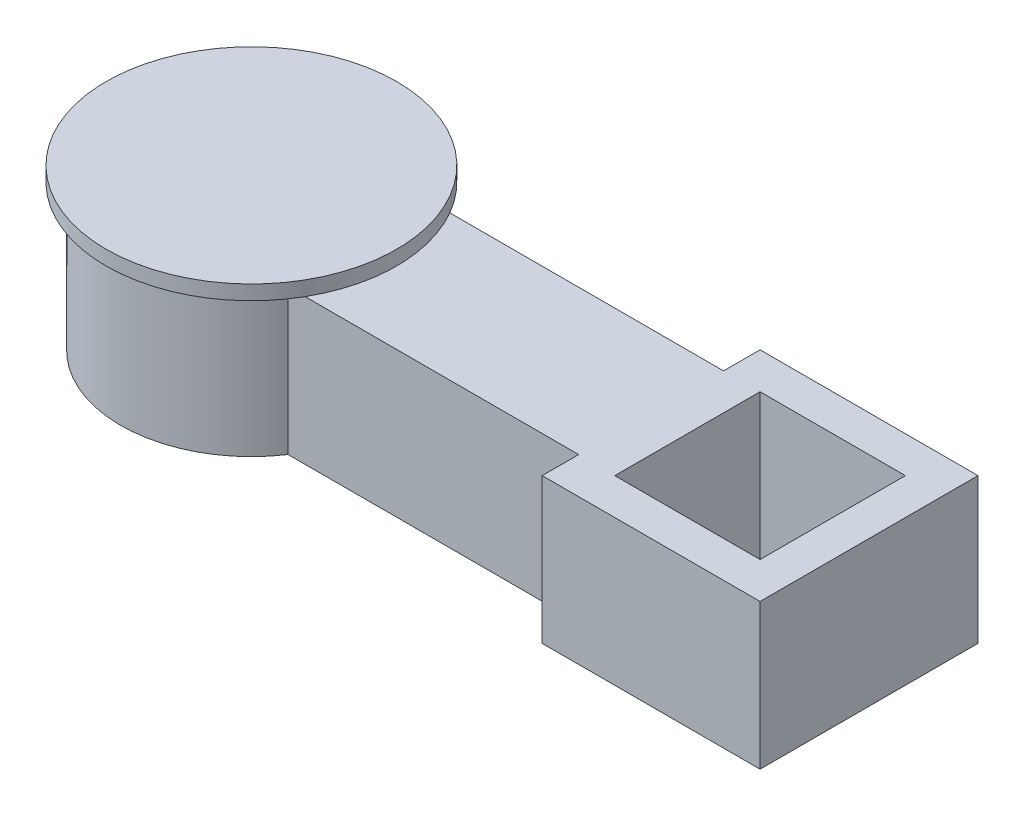
ISO-10303-21;
HEADER;
FILE_DESCRIPTION(('STEP AP214'),'2;1');
FILE_NAME('part.step','',(''),(''),'','','');
FILE_SCHEMA(('AUTOMOTIVE_DESIGN { 1 0 10303 214 1 1 1 1 }'));
ENDSEC;
DATA;
#1=APPLICATION_CONTEXT('core data for automotive mechanical design processes');
#2=APPLICATION_PROTOCOL_DEFINITION('international standard','automotive_design',2000,#1);
#3=PRODUCT_CONTEXT('',#1,'mechanical');
#4=PRODUCT('Part','Part','',(#3));
#5=PRODUCT_RELATED_PRODUCT_CATEGORY('part','',(#4));
#6=PRODUCT_DEFINITION_FORMATION('','',#4);
#7=PRODUCT_DEFINITION_CONTEXT('part definition',#1,'design');
#8=PRODUCT_DEFINITION('design','',#6,#7);
#9=PRODUCT_DEFINITION_SHAPE('','',#8);
#10=(LENGTH_UNIT() NAMED_UNIT(*) SI_UNIT(.MILLI.,.METRE.));
#11=(NAMED_UNIT(*) PLANE_ANGLE_UNIT() SI_UNIT($,.RADIAN.));
#12=(NAMED_UNIT(*) SI_UNIT($,.STERADIAN.) SOLID_ANGLE_UNIT());
#13=UNCERTAINTY_MEASURE_WITH_UNIT(LENGTH_MEASURE(1.E-05),#10,'distance_accuracy_value','');
#14=(GEOMETRIC_REPRESENTATION_CONTEXT(3) GLOBAL_UNCERTAINTY_ASSIGNED_CONTEXT((#13)) GLOBAL_UNIT_ASSIGNED_CONTEXT((#10,
#11,#12)) REPRESENTATION_CONTEXT('',''));
#15=CARTESIAN_POINT('',(0.,0.,0.));
#16=DIRECTION('',(0.,0.,1.));
#17=DIRECTION('',(1.,0.,0.));
#18=AXIS2_PLACEMENT_3D('',#15,#16,#17);
#19=CARTESIAN_POINT('',(363.145565833727,100.,8.04324209101972E-11));
#20=DIRECTION('',(-1.,0.,-2.21488098651395E-13));
#21=DIRECTION('',(-2.21488098651395E-13,0.,1.));
#22=AXIS2_PLACEMENT_3D('',#19,#20,#21);
#23=PLANE('',#22);
#24=DIRECTION('',(2.21488098651395E-13,0.,-1.));
#25=VECTOR('',#24,1.);
#26=CARTESIAN_POINT('',(363.145565833727,0.,8.04324209101972E-11));
#27=LINE('',#26,#25);
#28=CARTESIAN_POINT('',(363.145565833788,0.,-275.741810418657));
#29=VERTEX_POINT('',#28);
#30=CARTESIAN_POINT('',(363.145565833788,0.,-275.992438563326));
#31=VERTEX_POINT('',#30);
#32=EDGE_CURVE('E234',#29,#31,#27,.T.);
#33=ORIENTED_EDGE('',*,*,#32,.F.);
#34=DIRECTION('',(0.,-1.,0.));
#35=VECTOR('',#34,1.);
#36=CARTESIAN_POINT('',(363.145565833788,100.,-275.741810418657));
#37=LINE('',#36,#35);
#38=CARTESIAN_POINT('',(363.145565833788,100.,-275.741810418657));
#39=VERTEX_POINT('',#38);
#40=EDGE_CURVE('E12',#39,#29,#37,.T.);
#41=ORIENTED_EDGE('',*,*,#40,.F.);
#42=DIRECTION('',(2.21488098651395E-13,0.,-1.));
#43=VECTOR('',#42,1.);
#44=CARTESIAN_POINT('',(363.145565833727,100.,8.04324209101972E-11));
#45=LINE('',#44,#43);
#46=CARTESIAN_POINT('',(363.145565833788,100.,-275.992438563326));
#47=VERTEX_POINT('',#46);
#48=EDGE_CURVE('E219',#39,#47,#45,.T.);
#49=ORIENTED_EDGE('',*,*,#48,.T.);
#50=DIRECTION('',(0.,-1.,0.));
#51=VECTOR('',#50,1.);
#52=CARTESIAN_POINT('',(363.145565833788,100.,-275.992438563326));
#53=LINE('',#52,#51);
#54=EDGE_CURVE('E233',#47,#31,#53,.T.);
#55=ORIENTED_EDGE('',*,*,#54,.T.);
#56=EDGE_LOOP('',(#33,#41,#49,#55));
#57=FACE_BOUND('',#56,.T.);
#58=ADVANCED_FACE('F67',(#57),#23,.T.);
#59=CARTESIAN_POINT('',(288.145565833788,100.,-225.992438563326));
#60=DIRECTION('',(0.,-1.,0.));
#61=DIRECTION('',(0.,0.,-1.));
#62=AXIS2_PLACEMENT_3D('',#59,#60,#61);
#63=CYLINDRICAL_SURFACE('',#62,90.);
#64=CARTESIAN_POINT('',(288.145565833788,0.,-225.992438563326));
#65=DIRECTION('',(0.,1.,0.));
#66=DIRECTION('',(0.,0.,1.));
#67=AXIS2_PLACEMENT_3D('',#64,#65,#66);
#68=CIRCLE('',#67,90.);
#69=CARTESIAN_POINT('',(363.145565833788,0.,-176.243066707995));
#70=VERTEX_POINT('',#69);
#71=EDGE_CURVE('E237',#29,#70,#68,.T.);
#72=ORIENTED_EDGE('',*,*,#71,.T.);
#73=DIRECTION('',(0.,-1.,0.));
#74=VECTOR('',#73,1.);
#75=CARTESIAN_POINT('',(363.145565833788,100.,-176.243066707995));
#76=LINE('',#75,#74);
#77=CARTESIAN_POINT('',(363.145565833788,100.,-176.243066707995));
#78=VERTEX_POINT('',#77);
#79=EDGE_CURVE('E76',#78,#70,#76,.T.);
#80=ORIENTED_EDGE('',*,*,#79,.F.);
#81=CARTESIAN_POINT('',(288.145565833788,100.,-225.992438563326));
#82=DIRECTION('',(0.,1.,0.));
#83=DIRECTION('',(0.,0.,1.));
#84=AXIS2_PLACEMENT_3D('',#81,#82,#83);
#85=CIRCLE('',#84,90.);
#86=EDGE_CURVE('E222',#39,#78,#85,.T.);
#87=ORIENTED_EDGE('',*,*,#86,.F.);
#88=ORIENTED_EDGE('',*,*,#40,.T.);
#89=EDGE_LOOP('',(#72,#80,#87,#88));
#90=FACE_BOUND('',#89,.T.);
#91=ADVANCED_FACE('F315',(#90),#63,.T.);
#92=CARTESIAN_POINT('',(0.,100.,-176.243066707995));
#93=DIRECTION('',(0.,0.,-1.));
#94=DIRECTION('',(-1.,0.,0.));
#95=AXIS2_PLACEMENT_3D('',#92,#93,#94);
#96=PLANE('',#95);
#97=DIRECTION('',(1.,0.,0.));
#98=VECTOR('',#97,1.);
#99=CARTESIAN_POINT('',(0.,0.,-176.243066707995));
#100=LINE('',#99,#98);
#101=CARTESIAN_POINT('',(563.145565833788,0.,-176.243066707995));
#102=VERTEX_POINT('',#101);
#103=EDGE_CURVE('E239',#70,#102,#100,.T.);
#104=ORIENTED_EDGE('',*,*,#103,.T.);
#105=DIRECTION('',(0.,-1.,0.));
#106=VECTOR('',#105,1.);
#107=CARTESIAN_POINT('',(563.145565833788,100.,-176.243066707995));
#108=LINE('',#107,#106);
#109=CARTESIAN_POINT('',(563.145565833788,100.,-176.243066707995));
#110=VERTEX_POINT('',#109);
#111=EDGE_CURVE('E247',#110,#102,#108,.T.);
#112=ORIENTED_EDGE('',*,*,#111,.F.);
#113=DIRECTION('',(1.,0.,0.));
#114=VECTOR('',#113,1.);
#115=CARTESIAN_POINT('',(0.,100.,-176.243066707995));
#116=LINE('',#115,#114);
#117=CARTESIAN_POINT('',(374.892323698275,100.,-176.243066707995));
#118=VERTEX_POINT('',#117);
#119=EDGE_CURVE('E226',#118,#110,#116,.T.);
#120=ORIENTED_EDGE('',*,*,#119,.F.);
#121=EDGE_CURVE('E227',#78,#118,#116,.T.);
#122=ORIENTED_EDGE('',*,*,#121,.F.);
#123=ORIENTED_EDGE('',*,*,#79,.T.);
#124=EDGE_LOOP('',(#104,#112,#120,#122,#123));
#125=FACE_BOUND('',#124,.T.);
#126=ADVANCED_FACE('F311',(#125),#96,.F.);
#127=CARTESIAN_POINT('',(0.,100.,-275.992438563326));
#128=DIRECTION('',(0.,0.,-1.));
#129=DIRECTION('',(-1.,0.,0.));
#130=AXIS2_PLACEMENT_3D('',#127,#128,#129);
#131=PLANE('',#130);
#132=DIRECTION('',(1.,0.,0.));
#133=VECTOR('',#132,1.);
#134=CARTESIAN_POINT('',(0.,0.,-275.992438563326));
#135=LINE('',#134,#133);
#136=CARTESIAN_POINT('',(563.145565833788,0.,-275.992438563326));
#137=VERTEX_POINT('',#136);
#138=EDGE_CURVE('E223',#31,#137,#135,.T.);
#139=ORIENTED_EDGE('',*,*,#138,.F.);
#140=ORIENTED_EDGE('',*,*,#54,.F.);
#141=DIRECTION('',(1.,0.,0.));
#142=VECTOR('',#141,1.);
#143=CARTESIAN_POINT('',(0.,100.,-275.992438563326));
#144=LINE('',#143,#142);
#145=CARTESIAN_POINT('',(374.748106212232,100.,-275.992438563326));
#146=VERTEX_POINT('',#145);
#147=EDGE_CURVE('E231',#47,#146,#144,.T.);
#148=ORIENTED_EDGE('',*,*,#147,.T.);
#149=CARTESIAN_POINT('',(563.145565833788,100.,-275.992438563326));
#150=VERTEX_POINT('',#149);
#151=EDGE_CURVE('E230',#146,#150,#144,.T.);
#152=ORIENTED_EDGE('',*,*,#151,.T.);
#153=DIRECTION('',(0.,-1.,0.));
#154=VECTOR('',#153,1.);
#155=CARTESIAN_POINT('',(563.145565833788,100.,-275.992438563326));
#156=LINE('',#155,#154);
#157=EDGE_CURVE('E245',#150,#137,#156,.T.);
#158=ORIENTED_EDGE('',*,*,#157,.T.);
#159=EDGE_LOOP('',(#139,#140,#148,#152,#158));
#160=FACE_BOUND('',#159,.T.);
#161=ADVANCED_FACE('F322',(#160),#131,.T.);
#162=CARTESIAN_POINT('',(0.,100.,0.));
#163=DIRECTION('',(0.,1.,0.));
#164=DIRECTION('',(0.,0.,1.));
#165=AXIS2_PLACEMENT_3D('',#162,#163,#164);
#166=PLANE('',#165);
#167=DIRECTION('',(0.,0.,1.));
#168=VECTOR('',#167,1.);
#169=CARTESIAN_POINT('',(588.145565833788,100.,-176.117752635661));
#170=LINE('',#169,#168);
#171=CARTESIAN_POINT('',(588.145565833788,100.,-276.117752635661));
#172=VERTEX_POINT('',#171);
#173=CARTESIAN_POINT('',(588.145565833788,100.,-176.117752635661));
#174=VERTEX_POINT('',#173);
#175=EDGE_CURVE('E84',#172,#174,#170,.T.);
#176=ORIENTED_EDGE('',*,*,#175,.F.);
#177=DIRECTION('',(-1.,0.,0.));
#178=VECTOR('',#177,1.);
#179=CARTESIAN_POINT('',(588.145565833788,100.,-276.117752635661));
#180=LINE('',#179,#178);
#181=CARTESIAN_POINT('',(688.145565833788,100.,-276.117752635661));
#182=VERTEX_POINT('',#181);
#183=EDGE_CURVE('E187',#182,#172,#180,.T.);
#184=ORIENTED_EDGE('',*,*,#183,.F.);
#185=DIRECTION('',(0.,0.,-1.));
#186=VECTOR('',#185,1.);
#187=CARTESIAN_POINT('',(688.145565833788,100.,-176.117752635661));
#188=LINE('',#187,#186);
#189=CARTESIAN_POINT('',(688.145565833788,100.,-176.117752635661));
#190=VERTEX_POINT('',#189);
#191=EDGE_CURVE('E190',#190,#182,#188,.T.);
#192=ORIENTED_EDGE('',*,*,#191,.F.);
#193=DIRECTION('',(1.,0.,0.));
#194=VECTOR('',#193,1.);
#195=CARTESIAN_POINT('',(588.145565833788,100.,-176.117752635661));
#196=LINE('',#195,#194);
#197=EDGE_CURVE('E196',#174,#190,#196,.T.);
#198=ORIENTED_EDGE('',*,*,#197,.F.);
#199=EDGE_LOOP('',(#176,#184,#192,#198));
#200=FACE_BOUND('',#199,.T.);
#201=CARTESIAN_POINT('',(288.145565833788,100.,-225.992438563326));
#202=DIRECTION('',(0.,1.,0.));
#203=DIRECTION('',(0.,0.,1.));
#204=AXIS2_PLACEMENT_3D('',#201,#202,#203);
#205=CIRCLE('',#204,100.);
#206=EDGE_CURVE('E210',#118,#146,#205,.T.);
#207=ORIENTED_EDGE('',*,*,#206,.F.);
#208=ORIENTED_EDGE('',*,*,#119,.T.);
#209=DIRECTION('',(0.,0.,1.));
#210=VECTOR('',#209,1.);
#211=CARTESIAN_POINT('',(563.145565833788,100.,-301.117752635661));
#212=LINE('',#211,#210);
#213=CARTESIAN_POINT('',(563.145565833788,100.,-151.117752635661));
#214=VERTEX_POINT('',#213);
#215=EDGE_CURVE('E260',#110,#214,#212,.T.);
#216=ORIENTED_EDGE('',*,*,#215,.T.);
#217=DIRECTION('',(1.,0.,0.));
#218=VECTOR('',#217,1.);
#219=CARTESIAN_POINT('',(563.145565833788,100.,-151.117752635661));
#220=LINE('',#219,#218);
#221=CARTESIAN_POINT('',(713.145565833788,100.,-151.117752635661));
#222=VERTEX_POINT('',#221);
#223=EDGE_CURVE('E251',#214,#222,#220,.T.);
#224=ORIENTED_EDGE('',*,*,#223,.T.);
#225=DIRECTION('',(0.,0.,1.));
#226=VECTOR('',#225,1.);
#227=CARTESIAN_POINT('',(713.145565833788,100.,-301.117752635661));
#228=LINE('',#227,#226);
#229=CARTESIAN_POINT('',(713.145565833788,100.,-301.117752635661));
#230=VERTEX_POINT('',#229);
#231=EDGE_CURVE('E253',#230,#222,#228,.T.);
#232=ORIENTED_EDGE('',*,*,#231,.F.);
#233=DIRECTION('',(1.,0.,0.));
#234=VECTOR('',#233,1.);
#235=CARTESIAN_POINT('',(563.145565833788,100.,-301.117752635661));
#236=LINE('',#235,#234);
#237=CARTESIAN_POINT('',(563.145565833788,100.,-301.117752635661));
#238=VERTEX_POINT('',#237);
#239=EDGE_CURVE('E257',#238,#230,#236,.T.);
#240=ORIENTED_EDGE('',*,*,#239,.F.);
#241=EDGE_CURVE('E261',#238,#150,#212,.T.);
#242=ORIENTED_EDGE('',*,*,#241,.T.);
#243=ORIENTED_EDGE('',*,*,#151,.F.);
#244=EDGE_LOOP('',(#207,#208,#216,#224,#232,#240,#242,#243));
#245=FACE_BOUND('',#244,.T.);
#246=ADVANCED_FACE('F302',(#200,#245),#166,.T.);
#247=CARTESIAN_POINT('',(0.,0.,0.));
#248=DIRECTION('',(0.,1.,0.));
#249=DIRECTION('',(0.,0.,1.));
#250=AXIS2_PLACEMENT_3D('',#247,#248,#249);
#251=PLANE('',#250);
#252=DIRECTION('',(-1.,0.,0.));
#253=VECTOR('',#252,1.);
#254=CARTESIAN_POINT('',(588.145565833788,0.,-276.117752635661));
#255=LINE('',#254,#253);
#256=CARTESIAN_POINT('',(688.145565833788,0.,-276.117752635661));
#257=VERTEX_POINT('',#256);
#258=CARTESIAN_POINT('',(588.145565833788,0.,-276.117752635661));
#259=VERTEX_POINT('',#258);
#260=EDGE_CURVE('E177',#257,#259,#255,.T.);
#261=ORIENTED_EDGE('',*,*,#260,.T.);
#262=DIRECTION('',(0.,0.,1.));
#263=VECTOR('',#262,1.);
#264=CARTESIAN_POINT('',(588.145565833788,0.,-176.117752635661));
#265=LINE('',#264,#263);
#266=CARTESIAN_POINT('',(588.145565833788,0.,-176.117752635661));
#267=VERTEX_POINT('',#266);
#268=EDGE_CURVE('E171',#259,#267,#265,.T.);
#269=ORIENTED_EDGE('',*,*,#268,.T.);
#270=DIRECTION('',(1.,0.,0.));
#271=VECTOR('',#270,1.);
#272=CARTESIAN_POINT('',(588.145565833788,0.,-176.117752635661));
#273=LINE('',#272,#271);
#274=CARTESIAN_POINT('',(688.145565833788,0.,-176.117752635661));
#275=VERTEX_POINT('',#274);
#276=EDGE_CURVE('E180',#267,#275,#273,.T.);
#277=ORIENTED_EDGE('',*,*,#276,.T.);
#278=DIRECTION('',(0.,0.,-1.));
#279=VECTOR('',#278,1.);
#280=CARTESIAN_POINT('',(688.145565833788,0.,-176.117752635661));
#281=LINE('',#280,#279);
#282=EDGE_CURVE('E92',#275,#257,#281,.T.);
#283=ORIENTED_EDGE('',*,*,#282,.T.);
#284=EDGE_LOOP('',(#261,#269,#277,#283));
#285=FACE_BOUND('',#284,.T.);
#286=CARTESIAN_POINT('',(288.145565833788,0.,-225.992438563326));
#287=DIRECTION('',(0.,1.,0.));
#288=DIRECTION('',(0.,0.,1.));
#289=AXIS2_PLACEMENT_3D('',#286,#287,#288);
#290=CIRCLE('',#289,70.0000000000001);
#291=CARTESIAN_POINT('',(288.145565833788,0.,-155.992438563326));
#292=VERTEX_POINT('',#291);
#293=EDGE_CURVE('E213',#292,#292,#290,.T.);
#294=ORIENTED_EDGE('',*,*,#293,.T.);
#295=EDGE_LOOP('',(#294));
#296=FACE_BOUND('',#295,.T.);
#297=ORIENTED_EDGE('',*,*,#32,.T.);
#298=ORIENTED_EDGE('',*,*,#138,.T.);
#299=DIRECTION('',(0.,0.,1.));
#300=VECTOR('',#299,1.);
#301=CARTESIAN_POINT('',(563.145565833788,0.,-301.117752635661));
#302=LINE('',#301,#300);
#303=CARTESIAN_POINT('',(563.145565833788,0.,-301.117752635661));
#304=VERTEX_POINT('',#303);
#305=EDGE_CURVE('E254',#304,#137,#302,.T.);
#306=ORIENTED_EDGE('',*,*,#305,.F.);
#307=DIRECTION('',(1.,0.,0.));
#308=VECTOR('',#307,1.);
#309=CARTESIAN_POINT('',(563.145565833788,0.,-301.117752635661));
#310=LINE('',#309,#308);
#311=CARTESIAN_POINT('',(713.145565833788,0.,-301.117752635661));
#312=VERTEX_POINT('',#311);
#313=EDGE_CURVE('E270',#304,#312,#310,.T.);
#314=ORIENTED_EDGE('',*,*,#313,.T.);
#315=DIRECTION('',(0.,0.,1.));
#316=VECTOR('',#315,1.);
#317=CARTESIAN_POINT('',(713.145565833788,0.,-301.117752635661));
#318=LINE('',#317,#316);
#319=CARTESIAN_POINT('',(713.145565833788,0.,-151.117752635661));
#320=VERTEX_POINT('',#319);
#321=EDGE_CURVE('E267',#312,#320,#318,.T.);
#322=ORIENTED_EDGE('',*,*,#321,.T.);
#323=DIRECTION('',(1.,0.,0.));
#324=VECTOR('',#323,1.);
#325=CARTESIAN_POINT('',(563.145565833788,0.,-151.117752635661));
#326=LINE('',#325,#324);
#327=CARTESIAN_POINT('',(563.145565833788,0.,-151.117752635661));
#328=VERTEX_POINT('',#327);
#329=EDGE_CURVE('E216',#328,#320,#326,.T.);
#330=ORIENTED_EDGE('',*,*,#329,.F.);
#331=EDGE_CURVE('E273',#102,#328,#302,.T.);
#332=ORIENTED_EDGE('',*,*,#331,.F.);
#333=ORIENTED_EDGE('',*,*,#103,.F.);
#334=ORIENTED_EDGE('',*,*,#71,.F.);
#335=EDGE_LOOP('',(#297,#298,#306,#314,#322,#330,#332,#333,#334));
#336=FACE_BOUND('',#335,.T.);
#337=ADVANCED_FACE('F184',(#285,#296,#336),#251,.F.);
#338=CARTESIAN_POINT('',(713.145565833788,100.,-301.117752635661));
#339=DIRECTION('',(1.,0.,0.));
#340=DIRECTION('',(0.,0.,-1.));
#341=AXIS2_PLACEMENT_3D('',#338,#339,#340);
#342=PLANE('',#341);
#343=ORIENTED_EDGE('',*,*,#321,.F.);
#344=DIRECTION('',(0.,-1.,0.));
#345=VECTOR('',#344,1.);
#346=CARTESIAN_POINT('',(713.145565833788,100.,-301.117752635661));
#347=LINE('',#346,#345);
#348=EDGE_CURVE('E279',#230,#312,#347,.T.);
#349=ORIENTED_EDGE('',*,*,#348,.F.);
#350=ORIENTED_EDGE('',*,*,#231,.T.);
#351=DIRECTION('',(0.,-1.,0.));
#352=VECTOR('',#351,1.);
#353=CARTESIAN_POINT('',(713.145565833788,100.,-151.117752635661));
#354=LINE('',#353,#352);
#355=EDGE_CURVE('E71',#222,#320,#354,.T.);
#356=ORIENTED_EDGE('',*,*,#355,.T.);
#357=EDGE_LOOP('',(#343,#349,#350,#356));
#358=FACE_BOUND('',#357,.T.);
#359=ADVANCED_FACE('F285',(#358),#342,.T.);
#360=CARTESIAN_POINT('',(563.145565833788,100.,-301.117752635661));
#361=DIRECTION('',(0.,0.,-1.));
#362=DIRECTION('',(-1.,0.,0.));
#363=AXIS2_PLACEMENT_3D('',#360,#361,#362);
#364=PLANE('',#363);
#365=ORIENTED_EDGE('',*,*,#313,.F.);
#366=DIRECTION('',(0.,-1.,0.));
#367=VECTOR('',#366,1.);
#368=CARTESIAN_POINT('',(563.145565833788,100.,-301.117752635661));
#369=LINE('',#368,#367);
#370=EDGE_CURVE('E278',#238,#304,#369,.T.);
#371=ORIENTED_EDGE('',*,*,#370,.F.);
#372=ORIENTED_EDGE('',*,*,#239,.T.);
#373=ORIENTED_EDGE('',*,*,#348,.T.);
#374=EDGE_LOOP('',(#365,#371,#372,#373));
#375=FACE_BOUND('',#374,.T.);
#376=ADVANCED_FACE('F294',(#375),#364,.T.);
#377=CARTESIAN_POINT('',(563.145565833788,100.,-151.117752635661));
#378=DIRECTION('',(0.,0.,-1.));
#379=DIRECTION('',(-1.,0.,0.));
#380=AXIS2_PLACEMENT_3D('',#377,#378,#379);
#381=PLANE('',#380);
#382=ORIENTED_EDGE('',*,*,#329,.T.);
#383=ORIENTED_EDGE('',*,*,#355,.F.);
#384=ORIENTED_EDGE('',*,*,#223,.F.);
#385=DIRECTION('',(0.,-1.,0.));
#386=VECTOR('',#385,1.);
#387=CARTESIAN_POINT('',(563.145565833788,100.,-151.117752635661));
#388=LINE('',#387,#386);
#389=EDGE_CURVE('E264',#214,#328,#388,.T.);
#390=ORIENTED_EDGE('',*,*,#389,.T.);
#391=EDGE_LOOP('',(#382,#383,#384,#390));
#392=FACE_BOUND('',#391,.T.);
#393=ADVANCED_FACE('F69',(#392),#381,.F.);
#394=CARTESIAN_POINT('',(563.145565833788,100.,-301.117752635661));
#395=DIRECTION('',(1.,0.,0.));
#396=DIRECTION('',(0.,0.,-1.));
#397=AXIS2_PLACEMENT_3D('',#394,#395,#396);
#398=PLANE('',#397);
#399=ORIENTED_EDGE('',*,*,#215,.F.);
#400=ORIENTED_EDGE('',*,*,#111,.T.);
#401=ORIENTED_EDGE('',*,*,#331,.T.);
#402=ORIENTED_EDGE('',*,*,#389,.F.);
#403=EDGE_LOOP('',(#399,#400,#401,#402));
#404=FACE_BOUND('',#403,.T.);
#405=ADVANCED_FACE('F307',(#404),#398,.F.);
#406=ORIENTED_EDGE('',*,*,#157,.F.);
#407=ORIENTED_EDGE('',*,*,#241,.F.);
#408=ORIENTED_EDGE('',*,*,#370,.T.);
#409=ORIENTED_EDGE('',*,*,#305,.T.);
#410=EDGE_LOOP('',(#406,#407,#408,#409));
#411=FACE_BOUND('',#410,.T.);
#412=ADVANCED_FACE('F299',(#411),#398,.F.);
#413=CARTESIAN_POINT('',(288.145565833788,0.,-225.992438563326));
#414=DIRECTION('',(0.,1.,0.));
#415=DIRECTION('',(0.,0.,1.));
#416=AXIS2_PLACEMENT_3D('',#413,#414,#415);
#417=CYLINDRICAL_SURFACE('',#416,70.0000000000001);
#418=ORIENTED_EDGE('',*,*,#293,.F.);
#419=EDGE_LOOP('',(#418));
#420=FACE_BOUND('',#419,.T.);
#421=CARTESIAN_POINT('',(288.145565833788,100.,-225.992438563326));
#422=DIRECTION('',(0.,1.,0.));
#423=DIRECTION('',(0.,0.,1.));
#424=AXIS2_PLACEMENT_3D('',#421,#422,#423);
#425=CIRCLE('',#424,70.0000000000001);
#426=CARTESIAN_POINT('',(288.145565833788,100.,-155.992438563326));
#427=VERTEX_POINT('',#426);
#428=EDGE_CURVE('E209',#427,#427,#425,.T.);
#429=ORIENTED_EDGE('',*,*,#428,.T.);
#430=EDGE_LOOP('',(#429));
#431=FACE_BOUND('',#430,.T.);
#432=ADVANCED_FACE('F339',(#420,#431),#417,.F.);
#433=CARTESIAN_POINT('',(288.145565833788,110.,-225.992438563326));
#434=DIRECTION('',(0.,1.,0.));
#435=DIRECTION('',(0.,0.,1.));
#436=AXIS2_PLACEMENT_3D('',#433,#434,#435);
#437=PLANE('',#436);
#438=CARTESIAN_POINT('',(288.145565833788,110.,-225.992438563326));
#439=DIRECTION('',(0.,1.,0.));
#440=DIRECTION('',(0.,0.,1.));
#441=AXIS2_PLACEMENT_3D('',#438,#439,#440);
#442=CIRCLE('',#441,100.);
#443=CARTESIAN_POINT('',(288.145565833788,110.,-125.992438563326));
#444=VERTEX_POINT('',#443);
#445=EDGE_CURVE('E206',#444,#444,#442,.T.);
#446=ORIENTED_EDGE('',*,*,#445,.T.);
#447=EDGE_LOOP('',(#446));
#448=FACE_BOUND('',#447,.T.);
#449=ADVANCED_FACE('F330',(#448),#437,.T.);
#450=CARTESIAN_POINT('',(288.145565833788,110.,-225.992438563326));
#451=DIRECTION('',(0.,-1.,0.));
#452=DIRECTION('',(0.,0.,-1.));
#453=AXIS2_PLACEMENT_3D('',#450,#451,#452);
#454=CYLINDRICAL_SURFACE('',#453,100.);
#455=ORIENTED_EDGE('',*,*,#445,.F.);
#456=EDGE_LOOP('',(#455));
#457=FACE_BOUND('',#456,.T.);
#458=ORIENTED_EDGE('',*,*,#206,.T.);
#459=EDGE_CURVE('E202',#146,#118,#205,.T.);
#460=ORIENTED_EDGE('',*,*,#459,.T.);
#461=EDGE_LOOP('',(#458,#460));
#462=FACE_BOUND('',#461,.T.);
#463=ADVANCED_FACE('F328',(#457,#462),#454,.T.);
#464=CARTESIAN_POINT('',(288.145565833788,100.,-225.992438563326));
#465=DIRECTION('',(0.,1.,0.));
#466=DIRECTION('',(0.,0.,1.));
#467=AXIS2_PLACEMENT_3D('',#464,#465,#466);
#468=PLANE('',#467);
#469=ORIENTED_EDGE('',*,*,#86,.T.);
#470=ORIENTED_EDGE('',*,*,#121,.T.);
#471=ORIENTED_EDGE('',*,*,#459,.F.);
#472=ORIENTED_EDGE('',*,*,#147,.F.);
#473=ORIENTED_EDGE('',*,*,#48,.F.);
#474=EDGE_LOOP('',(#469,#470,#471,#472,#473));
#475=FACE_BOUND('',#474,.T.);
#476=ADVANCED_FACE('F326',(#475),#468,.F.);
#477=ORIENTED_EDGE('',*,*,#428,.F.);
#478=EDGE_LOOP('',(#477));
#479=FACE_BOUND('',#478,.T.);
#480=ADVANCED_FACE('F337',(#479),#468,.F.);
#481=CARTESIAN_POINT('',(588.145565833788,0.,-176.117752635661));
#482=DIRECTION('',(-1.,0.,0.));
#483=DIRECTION('',(0.,0.,1.));
#484=AXIS2_PLACEMENT_3D('',#481,#482,#483);
#485=PLANE('',#484);
#486=ORIENTED_EDGE('',*,*,#175,.T.);
#487=DIRECTION('',(0.,1.,0.));
#488=VECTOR('',#487,1.);
#489=CARTESIAN_POINT('',(588.145565833788,0.,-176.117752635661));
#490=LINE('',#489,#488);
#491=EDGE_CURVE('E167',#267,#174,#490,.T.);
#492=ORIENTED_EDGE('',*,*,#491,.F.);
#493=ORIENTED_EDGE('',*,*,#268,.F.);
#494=DIRECTION('',(0.,1.,0.));
#495=VECTOR('',#494,1.);
#496=CARTESIAN_POINT('',(588.145565833788,0.,-276.117752635661));
#497=LINE('',#496,#495);
#498=EDGE_CURVE('E200',#259,#172,#497,.T.);
#499=ORIENTED_EDGE('',*,*,#498,.T.);
#500=EDGE_LOOP('',(#486,#492,#493,#499));
#501=FACE_BOUND('',#500,.T.);
#502=ADVANCED_FACE('F169',(#501),#485,.F.);
#503=CARTESIAN_POINT('',(588.145565833788,0.,-276.117752635661));
#504=DIRECTION('',(0.,0.,-1.));
#505=DIRECTION('',(-1.,0.,0.));
#506=AXIS2_PLACEMENT_3D('',#503,#504,#505);
#507=PLANE('',#506);
#508=ORIENTED_EDGE('',*,*,#183,.T.);
#509=ORIENTED_EDGE('',*,*,#498,.F.);
#510=ORIENTED_EDGE('',*,*,#260,.F.);
#511=DIRECTION('',(0.,1.,0.));
#512=VECTOR('',#511,1.);
#513=CARTESIAN_POINT('',(688.145565833788,0.,-276.117752635661));
#514=LINE('',#513,#512);
#515=EDGE_CURVE('E203',#257,#182,#514,.T.);
#516=ORIENTED_EDGE('',*,*,#515,.T.);
#517=EDGE_LOOP('',(#508,#509,#510,#516));
#518=FACE_BOUND('',#517,.T.);
#519=ADVANCED_FACE('F378',(#518),#507,.F.);
#520=CARTESIAN_POINT('',(688.145565833788,0.,-176.117752635661));
#521=DIRECTION('',(1.,0.,0.));
#522=DIRECTION('',(0.,0.,-1.));
#523=AXIS2_PLACEMENT_3D('',#520,#521,#522);
#524=PLANE('',#523);
#525=ORIENTED_EDGE('',*,*,#191,.T.);
#526=ORIENTED_EDGE('',*,*,#515,.F.);
#527=ORIENTED_EDGE('',*,*,#282,.F.);
#528=DIRECTION('',(0.,1.,0.));
#529=VECTOR('',#528,1.);
#530=CARTESIAN_POINT('',(688.145565833788,0.,-176.117752635661));
#531=LINE('',#530,#529);
#532=EDGE_CURVE('E176',#275,#190,#531,.T.);
#533=ORIENTED_EDGE('',*,*,#532,.T.);
#534=EDGE_LOOP('',(#525,#526,#527,#533));
#535=FACE_BOUND('',#534,.T.);
#536=ADVANCED_FACE('F383',(#535),#524,.F.);
#537=CARTESIAN_POINT('',(588.145565833788,0.,-176.117752635661));
#538=DIRECTION('',(0.,0.,1.));
#539=DIRECTION('',(1.,0.,0.));
#540=AXIS2_PLACEMENT_3D('',#537,#538,#539);
#541=PLANE('',#540);
#542=ORIENTED_EDGE('',*,*,#197,.T.);
#543=ORIENTED_EDGE('',*,*,#532,.F.);
#544=ORIENTED_EDGE('',*,*,#276,.F.);
#545=ORIENTED_EDGE('',*,*,#491,.T.);
#546=EDGE_LOOP('',(#542,#543,#544,#545));
#547=FACE_BOUND('',#546,.T.);
#548=ADVANCED_FACE('F181',(#547),#541,.F.);
#549=CLOSED_SHELL('',(#58,#91,#126,#161,#246,#337,#359,#376,#393,#405,#412,#432,#449,#463,#476,
#480,#502,#519,#536,#548));
#550=MANIFOLD_SOLID_BREP('B2',#549);
#551=ADVANCED_BREP_SHAPE_REPRESENTATION('',(#18,#550),#14);
#552=SHAPE_DEFINITION_REPRESENTATION(#9,#551);
ENDSEC;
END-ISO-10303-21;
